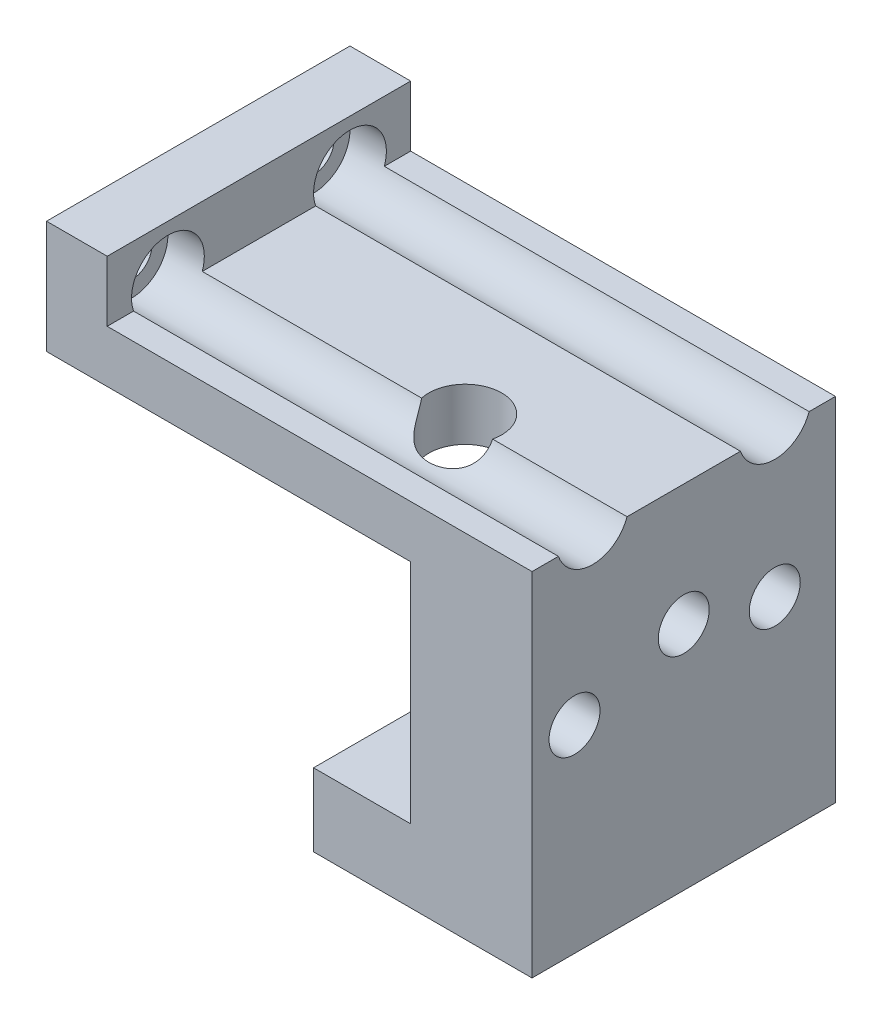
ISO-10303-21;
HEADER;
FILE_DESCRIPTION(('STEP AP214'),'2;1');
FILE_NAME('part.step','',(''),(''),'','','');
FILE_SCHEMA(('AUTOMOTIVE_DESIGN { 1 0 10303 214 1 1 1 1 }'));
ENDSEC;
DATA;
#1=APPLICATION_CONTEXT('core data for automotive mechanical design processes');
#2=APPLICATION_PROTOCOL_DEFINITION('international standard','automotive_design',2000,#1);
#3=PRODUCT_CONTEXT('',#1,'mechanical');
#4=PRODUCT('Part','Part','',(#3));
#5=PRODUCT_RELATED_PRODUCT_CATEGORY('part','',(#4));
#6=PRODUCT_DEFINITION_FORMATION('','',#4);
#7=PRODUCT_DEFINITION_CONTEXT('part definition',#1,'design');
#8=PRODUCT_DEFINITION('design','',#6,#7);
#9=PRODUCT_DEFINITION_SHAPE('','',#8);
#10=(LENGTH_UNIT() NAMED_UNIT(*) SI_UNIT(.MILLI.,.METRE.));
#11=(NAMED_UNIT(*) PLANE_ANGLE_UNIT() SI_UNIT($,.RADIAN.));
#12=(NAMED_UNIT(*) SI_UNIT($,.STERADIAN.) SOLID_ANGLE_UNIT());
#13=UNCERTAINTY_MEASURE_WITH_UNIT(LENGTH_MEASURE(1.E-05),#10,'distance_accuracy_value','');
#14=(GEOMETRIC_REPRESENTATION_CONTEXT(3) GLOBAL_UNCERTAINTY_ASSIGNED_CONTEXT((#13)) GLOBAL_UNIT_ASSIGNED_CONTEXT((#10,
#11,#12)) REPRESENTATION_CONTEXT('',''));
#15=CARTESIAN_POINT('',(0.,0.,0.));
#16=DIRECTION('',(0.,0.,1.));
#17=DIRECTION('',(1.,0.,0.));
#18=AXIS2_PLACEMENT_3D('',#15,#16,#17);
#19=CARTESIAN_POINT('',(20.,-17.,12.5));
#20=DIRECTION('',(-1.,0.,0.));
#21=DIRECTION('',(0.,0.,1.));
#22=AXIS2_PLACEMENT_3D('',#19,#20,#21);
#23=PLANE('',#22);
#24=CARTESIAN_POINT('',(20.,0.199999999999997,-7.5));
#25=DIRECTION('',(1.,0.,0.));
#26=DIRECTION('',(0.,0.,-1.));
#27=AXIS2_PLACEMENT_3D('',#24,#25,#26);
#28=CIRCLE('',#27,2.10000000000001);
#29=CARTESIAN_POINT('',(20.,0.199999999999997,-9.60000000000002));
#30=VERTEX_POINT('',#29);
#31=EDGE_CURVE('E351',#30,#30,#28,.T.);
#32=ORIENTED_EDGE('',*,*,#31,.F.);
#33=EDGE_LOOP('',(#32));
#34=FACE_BOUND('',#33,.T.);
#35=CARTESIAN_POINT('',(20.,2.,0.));
#36=DIRECTION('',(1.,0.,0.));
#37=DIRECTION('',(0.,0.,-1.));
#38=AXIS2_PLACEMENT_3D('',#35,#36,#37);
#39=CIRCLE('',#38,2.1);
#40=CARTESIAN_POINT('',(20.,2.,-2.1));
#41=VERTEX_POINT('',#40);
#42=EDGE_CURVE('E147',#41,#41,#39,.T.);
#43=ORIENTED_EDGE('',*,*,#42,.F.);
#44=EDGE_LOOP('',(#43));
#45=FACE_BOUND('',#44,.T.);
#46=CARTESIAN_POINT('',(20.,-0.700000000000006,9.));
#47=DIRECTION('',(1.,0.,0.));
#48=DIRECTION('',(0.,0.,-1.));
#49=AXIS2_PLACEMENT_3D('',#46,#47,#48);
#50=CIRCLE('',#49,2.1);
#51=CARTESIAN_POINT('',(20.,-0.700000000000006,6.9));
#52=VERTEX_POINT('',#51);
#53=EDGE_CURVE('E357',#52,#52,#50,.T.);
#54=ORIENTED_EDGE('',*,*,#53,.F.);
#55=EDGE_LOOP('',(#54));
#56=FACE_BOUND('',#55,.T.);
#57=DIRECTION('',(0.,1.,0.));
#58=VECTOR('',#57,1.);
#59=CARTESIAN_POINT('',(20.,-17.,-12.5));
#60=LINE('',#59,#58);
#61=CARTESIAN_POINT('',(20.,-17.,-12.5));
#62=VERTEX_POINT('',#61);
#63=CARTESIAN_POINT('',(20.,12.,-12.5));
#64=VERTEX_POINT('',#63);
#65=EDGE_CURVE('E195',#62,#64,#60,.T.);
#66=ORIENTED_EDGE('',*,*,#65,.T.);
#67=DIRECTION('',(0.,0.,1.));
#68=VECTOR('',#67,1.);
#69=CARTESIAN_POINT('',(20.,12.,-12.5));
#70=LINE('',#69,#68);
#71=CARTESIAN_POINT('',(20.,12.,-10.3284271247462));
#72=VERTEX_POINT('',#71);
#73=EDGE_CURVE('E239',#64,#72,#70,.T.);
#74=ORIENTED_EDGE('',*,*,#73,.T.);
#75=CARTESIAN_POINT('',(20.,13.,-7.5));
#76=DIRECTION('',(1.,0.,0.));
#77=DIRECTION('',(0.,0.,-1.));
#78=AXIS2_PLACEMENT_3D('',#75,#76,#77);
#79=CIRCLE('',#78,3.);
#80=CARTESIAN_POINT('',(20.,12.,-4.67157287525381));
#81=VERTEX_POINT('',#80);
#82=EDGE_CURVE('E183',#81,#72,#79,.T.);
#83=ORIENTED_EDGE('',*,*,#82,.F.);
#84=CARTESIAN_POINT('',(20.,12.,4.67157287525382));
#85=VERTEX_POINT('',#84);
#86=EDGE_CURVE('E249',#81,#85,#70,.T.);
#87=ORIENTED_EDGE('',*,*,#86,.T.);
#88=CARTESIAN_POINT('',(20.,13.,7.5));
#89=DIRECTION('',(1.,0.,0.));
#90=DIRECTION('',(0.,0.,-1.));
#91=AXIS2_PLACEMENT_3D('',#88,#89,#90);
#92=CIRCLE('',#91,3.);
#93=CARTESIAN_POINT('',(20.,12.,10.3284271247462));
#94=VERTEX_POINT('',#93);
#95=EDGE_CURVE('E161',#94,#85,#92,.T.);
#96=ORIENTED_EDGE('',*,*,#95,.F.);
#97=CARTESIAN_POINT('',(20.,12.,12.5));
#98=VERTEX_POINT('',#97);
#99=EDGE_CURVE('E235',#94,#98,#70,.T.);
#100=ORIENTED_EDGE('',*,*,#99,.T.);
#101=DIRECTION('',(0.,1.,0.));
#102=VECTOR('',#101,1.);
#103=CARTESIAN_POINT('',(20.,-17.,12.5));
#104=LINE('',#103,#102);
#105=CARTESIAN_POINT('',(20.,-17.,12.5));
#106=VERTEX_POINT('',#105);
#107=EDGE_CURVE('E196',#106,#98,#104,.T.);
#108=ORIENTED_EDGE('',*,*,#107,.F.);
#109=DIRECTION('',(0.,0.,-1.));
#110=VECTOR('',#109,1.);
#111=CARTESIAN_POINT('',(20.,-17.,12.5));
#112=LINE('',#111,#110);
#113=EDGE_CURVE('E207',#106,#62,#112,.T.);
#114=ORIENTED_EDGE('',*,*,#113,.T.);
#115=EDGE_LOOP('',(#66,#74,#83,#87,#96,#100,#108,#114));
#116=FACE_BOUND('',#115,.T.);
#117=ADVANCED_FACE('F39',(#34,#45,#56,#116),#23,.F.);
#118=CARTESIAN_POINT('',(-20.,17.,12.5));
#119=DIRECTION('',(0.,-1.,0.));
#120=DIRECTION('',(0.,0.,-1.));
#121=AXIS2_PLACEMENT_3D('',#118,#119,#120);
#122=PLANE('',#121);
#123=DIRECTION('',(-1.,0.,0.));
#124=VECTOR('',#123,1.);
#125=CARTESIAN_POINT('',(-20.,17.,12.5));
#126=LINE('',#125,#124);
#127=CARTESIAN_POINT('',(-15.,17.,12.5));
#128=VERTEX_POINT('',#127);
#129=CARTESIAN_POINT('',(-20.,17.,12.5));
#130=VERTEX_POINT('',#129);
#131=EDGE_CURVE('E199',#128,#130,#126,.T.);
#132=ORIENTED_EDGE('',*,*,#131,.F.);
#133=DIRECTION('',(0.,0.,1.));
#134=VECTOR('',#133,1.);
#135=CARTESIAN_POINT('',(-15.,17.,-12.5));
#136=LINE('',#135,#134);
#137=CARTESIAN_POINT('',(-15.,17.,-12.5));
#138=VERTEX_POINT('',#137);
#139=EDGE_CURVE('E236',#138,#128,#136,.T.);
#140=ORIENTED_EDGE('',*,*,#139,.F.);
#141=DIRECTION('',(-1.,0.,0.));
#142=VECTOR('',#141,1.);
#143=CARTESIAN_POINT('',(-20.,17.,-12.5));
#144=LINE('',#143,#142);
#145=CARTESIAN_POINT('',(-20.,17.,-12.5));
#146=VERTEX_POINT('',#145);
#147=EDGE_CURVE('E210',#138,#146,#144,.T.);
#148=ORIENTED_EDGE('',*,*,#147,.T.);
#149=DIRECTION('',(0.,0.,-1.));
#150=VECTOR('',#149,1.);
#151=CARTESIAN_POINT('',(-20.,17.,12.5));
#152=LINE('',#151,#150);
#153=EDGE_CURVE('E218',#130,#146,#152,.T.);
#154=ORIENTED_EDGE('',*,*,#153,.F.);
#155=EDGE_LOOP('',(#132,#140,#148,#154));
#156=FACE_BOUND('',#155,.T.);
#157=ADVANCED_FACE('F289',(#156),#122,.F.);
#158=CARTESIAN_POINT('',(-20.,-17.,12.5));
#159=DIRECTION('',(1.,0.,0.));
#160=DIRECTION('',(0.,0.,-1.));
#161=AXIS2_PLACEMENT_3D('',#158,#159,#160);
#162=PLANE('',#161);
#163=CARTESIAN_POINT('',(-20.,13.,7.5));
#164=DIRECTION('',(1.,0.,0.));
#165=DIRECTION('',(0.,0.,-1.));
#166=AXIS2_PLACEMENT_3D('',#163,#164,#165);
#167=CIRCLE('',#166,1.69999999999999);
#168=CARTESIAN_POINT('',(-20.,13.,5.80000000000001));
#169=VERTEX_POINT('',#168);
#170=EDGE_CURVE('E180',#169,#169,#167,.T.);
#171=ORIENTED_EDGE('',*,*,#170,.T.);
#172=EDGE_LOOP('',(#171));
#173=FACE_BOUND('',#172,.T.);
#174=CARTESIAN_POINT('',(-20.,13.,-7.5));
#175=DIRECTION('',(1.,0.,0.));
#176=DIRECTION('',(0.,0.,-1.));
#177=AXIS2_PLACEMENT_3D('',#174,#175,#176);
#178=CIRCLE('',#177,1.69999999999999);
#179=CARTESIAN_POINT('',(-20.,13.,-9.19999999999999));
#180=VERTEX_POINT('',#179);
#181=EDGE_CURVE('E192',#180,#180,#178,.T.);
#182=ORIENTED_EDGE('',*,*,#181,.T.);
#183=EDGE_LOOP('',(#182));
#184=FACE_BOUND('',#183,.T.);
#185=DIRECTION('',(0.,-1.,0.));
#186=VECTOR('',#185,1.);
#187=CARTESIAN_POINT('',(-20.,-17.,-12.5));
#188=LINE('',#187,#186);
#189=CARTESIAN_POINT('',(-20.,7.7,-12.5));
#190=VERTEX_POINT('',#189);
#191=EDGE_CURVE('E212',#146,#190,#188,.T.);
#192=ORIENTED_EDGE('',*,*,#191,.T.);
#193=DIRECTION('',(0.,0.,1.));
#194=VECTOR('',#193,1.);
#195=CARTESIAN_POINT('',(-20.,7.7,-12.5));
#196=LINE('',#195,#194);
#197=CARTESIAN_POINT('',(-20.,7.7,12.5));
#198=VERTEX_POINT('',#197);
#199=EDGE_CURVE('E283',#190,#198,#196,.T.);
#200=ORIENTED_EDGE('',*,*,#199,.T.);
#201=DIRECTION('',(0.,-1.,0.));
#202=VECTOR('',#201,1.);
#203=CARTESIAN_POINT('',(-20.,-17.,12.5));
#204=LINE('',#203,#202);
#205=EDGE_CURVE('E202',#130,#198,#204,.T.);
#206=ORIENTED_EDGE('',*,*,#205,.F.);
#207=ORIENTED_EDGE('',*,*,#153,.T.);
#208=EDGE_LOOP('',(#192,#200,#206,#207));
#209=FACE_BOUND('',#208,.T.);
#210=ADVANCED_FACE('F294',(#173,#184,#209),#162,.F.);
#211=CARTESIAN_POINT('',(-20.,-17.,12.5));
#212=DIRECTION('',(0.,1.,0.));
#213=DIRECTION('',(0.,0.,1.));
#214=AXIS2_PLACEMENT_3D('',#211,#212,#213);
#215=PLANE('',#214);
#216=CARTESIAN_POINT('',(5.99999999999999,-17.,4.));
#217=DIRECTION('',(0.,1.,0.));
#218=DIRECTION('',(0.,0.,1.));
#219=AXIS2_PLACEMENT_3D('',#216,#217,#218);
#220=CIRCLE('',#219,1.025);
#221=CARTESIAN_POINT('',(5.99999999999999,-17.,5.025));
#222=VERTEX_POINT('',#221);
#223=EDGE_CURVE('E324',#222,#222,#220,.T.);
#224=ORIENTED_EDGE('',*,*,#223,.T.);
#225=EDGE_LOOP('',(#224));
#226=FACE_BOUND('',#225,.T.);
#227=DIRECTION('',(1.,0.,0.));
#228=VECTOR('',#227,1.);
#229=CARTESIAN_POINT('',(-20.,-17.,12.5));
#230=LINE('',#229,#228);
#231=CARTESIAN_POINT('',(2.,-17.,12.5));
#232=VERTEX_POINT('',#231);
#233=EDGE_CURVE('E205',#232,#106,#230,.T.);
#234=ORIENTED_EDGE('',*,*,#233,.F.);
#235=DIRECTION('',(0.,0.,1.));
#236=VECTOR('',#235,1.);
#237=CARTESIAN_POINT('',(2.,-17.,-12.5));
#238=LINE('',#237,#236);
#239=CARTESIAN_POINT('',(2.,-17.,-12.5));
#240=VERTEX_POINT('',#239);
#241=EDGE_CURVE('E314',#240,#232,#238,.T.);
#242=ORIENTED_EDGE('',*,*,#241,.F.);
#243=DIRECTION('',(1.,0.,0.));
#244=VECTOR('',#243,1.);
#245=CARTESIAN_POINT('',(-20.,-17.,-12.5));
#246=LINE('',#245,#244);
#247=EDGE_CURVE('E200',#240,#62,#246,.T.);
#248=ORIENTED_EDGE('',*,*,#247,.T.);
#249=ORIENTED_EDGE('',*,*,#113,.F.);
#250=EDGE_LOOP('',(#234,#242,#248,#249));
#251=FACE_BOUND('',#250,.T.);
#252=ADVANCED_FACE('F269',(#226,#251),#215,.F.);
#253=CARTESIAN_POINT('',(0.,0.,12.5));
#254=DIRECTION('',(0.,0.,-1.));
#255=DIRECTION('',(-1.,0.,0.));
#256=AXIS2_PLACEMENT_3D('',#253,#254,#255);
#257=PLANE('',#256);
#258=ORIENTED_EDGE('',*,*,#205,.T.);
#259=DIRECTION('',(-1.,0.,0.));
#260=VECTOR('',#259,1.);
#261=CARTESIAN_POINT('',(-20.,7.7,12.5));
#262=LINE('',#261,#260);
#263=CARTESIAN_POINT('',(10.,7.69999999999999,12.5));
#264=VERTEX_POINT('',#263);
#265=EDGE_CURVE('E297',#264,#198,#262,.T.);
#266=ORIENTED_EDGE('',*,*,#265,.F.);
#267=DIRECTION('',(0.,1.,0.));
#268=VECTOR('',#267,1.);
#269=CARTESIAN_POINT('',(10.,-11.,12.5));
#270=LINE('',#269,#268);
#271=CARTESIAN_POINT('',(10.,-11.,12.5));
#272=VERTEX_POINT('',#271);
#273=EDGE_CURVE('E299',#272,#264,#270,.T.);
#274=ORIENTED_EDGE('',*,*,#273,.F.);
#275=DIRECTION('',(1.,0.,0.));
#276=VECTOR('',#275,1.);
#277=CARTESIAN_POINT('',(10.,-11.,12.5));
#278=LINE('',#277,#276);
#279=CARTESIAN_POINT('',(2.,-11.,12.5));
#280=VERTEX_POINT('',#279);
#281=EDGE_CURVE('E304',#280,#272,#278,.T.);
#282=ORIENTED_EDGE('',*,*,#281,.F.);
#283=DIRECTION('',(0.,1.,0.));
#284=VECTOR('',#283,1.);
#285=CARTESIAN_POINT('',(2.,-11.,12.5));
#286=LINE('',#285,#284);
#287=EDGE_CURVE('E266',#232,#280,#286,.T.);
#288=ORIENTED_EDGE('',*,*,#287,.F.);
#289=ORIENTED_EDGE('',*,*,#233,.T.);
#290=ORIENTED_EDGE('',*,*,#107,.T.);
#291=DIRECTION('',(1.,0.,0.));
#292=VECTOR('',#291,1.);
#293=CARTESIAN_POINT('',(20.,12.,12.5));
#294=LINE('',#293,#292);
#295=CARTESIAN_POINT('',(-15.,12.,12.5));
#296=VERTEX_POINT('',#295);
#297=EDGE_CURVE('E260',#296,#98,#294,.T.);
#298=ORIENTED_EDGE('',*,*,#297,.F.);
#299=DIRECTION('',(0.,-1.,0.));
#300=VECTOR('',#299,1.);
#301=CARTESIAN_POINT('',(-15.,17.,12.5));
#302=LINE('',#301,#300);
#303=EDGE_CURVE('E282',#128,#296,#302,.T.);
#304=ORIENTED_EDGE('',*,*,#303,.F.);
#305=ORIENTED_EDGE('',*,*,#131,.T.);
#306=EDGE_LOOP('',(#258,#266,#274,#282,#288,#289,#290,#298,#304,#305));
#307=FACE_BOUND('',#306,.T.);
#308=ADVANCED_FACE('F258',(#307),#257,.F.);
#309=CARTESIAN_POINT('',(0.,0.,-12.5));
#310=DIRECTION('',(0.,0.,-1.));
#311=DIRECTION('',(-1.,0.,0.));
#312=AXIS2_PLACEMENT_3D('',#309,#310,#311);
#313=PLANE('',#312);
#314=DIRECTION('',(-1.,0.,0.));
#315=VECTOR('',#314,1.);
#316=CARTESIAN_POINT('',(-20.,7.7,-12.5));
#317=LINE('',#316,#315);
#318=CARTESIAN_POINT('',(10.,7.69999999999999,-12.5));
#319=VERTEX_POINT('',#318);
#320=EDGE_CURVE('E315',#319,#190,#317,.T.);
#321=ORIENTED_EDGE('',*,*,#320,.T.);
#322=ORIENTED_EDGE('',*,*,#191,.F.);
#323=ORIENTED_EDGE('',*,*,#147,.F.);
#324=DIRECTION('',(0.,-1.,0.));
#325=VECTOR('',#324,1.);
#326=CARTESIAN_POINT('',(-15.,17.,-12.5));
#327=LINE('',#326,#325);
#328=CARTESIAN_POINT('',(-15.,12.,-12.5));
#329=VERTEX_POINT('',#328);
#330=EDGE_CURVE('E277',#138,#329,#327,.T.);
#331=ORIENTED_EDGE('',*,*,#330,.T.);
#332=DIRECTION('',(1.,0.,0.));
#333=VECTOR('',#332,1.);
#334=CARTESIAN_POINT('',(20.,12.,-12.5));
#335=LINE('',#334,#333);
#336=EDGE_CURVE('E242',#329,#64,#335,.T.);
#337=ORIENTED_EDGE('',*,*,#336,.T.);
#338=ORIENTED_EDGE('',*,*,#65,.F.);
#339=ORIENTED_EDGE('',*,*,#247,.F.);
#340=DIRECTION('',(0.,1.,0.));
#341=VECTOR('',#340,1.);
#342=CARTESIAN_POINT('',(2.,-11.,-12.5));
#343=LINE('',#342,#341);
#344=CARTESIAN_POINT('',(2.,-11.,-12.5));
#345=VERTEX_POINT('',#344);
#346=EDGE_CURVE('E301',#240,#345,#343,.T.);
#347=ORIENTED_EDGE('',*,*,#346,.T.);
#348=DIRECTION('',(1.,0.,0.));
#349=VECTOR('',#348,1.);
#350=CARTESIAN_POINT('',(10.,-11.,-12.5));
#351=LINE('',#350,#349);
#352=CARTESIAN_POINT('',(10.,-11.,-12.5));
#353=VERTEX_POINT('',#352);
#354=EDGE_CURVE('E61',#345,#353,#351,.T.);
#355=ORIENTED_EDGE('',*,*,#354,.T.);
#356=DIRECTION('',(0.,1.,0.));
#357=VECTOR('',#356,1.);
#358=CARTESIAN_POINT('',(10.,-11.,-12.5));
#359=LINE('',#358,#357);
#360=EDGE_CURVE('E317',#353,#319,#359,.T.);
#361=ORIENTED_EDGE('',*,*,#360,.T.);
#362=EDGE_LOOP('',(#321,#322,#323,#331,#337,#338,#339,#347,#355,#361));
#363=FACE_BOUND('',#362,.T.);
#364=ADVANCED_FACE('F273',(#363),#313,.T.);
#365=CARTESIAN_POINT('',(20.,13.,-7.5));
#366=DIRECTION('',(1.,0.,0.));
#367=DIRECTION('',(0.,0.,-1.));
#368=AXIS2_PLACEMENT_3D('',#365,#366,#367);
#369=CYLINDRICAL_SURFACE('',#368,1.69999999999999);
#370=ORIENTED_EDGE('',*,*,#181,.F.);
#371=EDGE_LOOP('',(#370));
#372=FACE_BOUND('',#371,.T.);
#373=CARTESIAN_POINT('',(-18.,13.,-7.5));
#374=DIRECTION('',(1.,0.,0.));
#375=DIRECTION('',(0.,0.,-1.));
#376=AXIS2_PLACEMENT_3D('',#373,#374,#375);
#377=CIRCLE('',#376,1.69999999999999);
#378=CARTESIAN_POINT('',(-18.,13.,-9.19999999999999));
#379=VERTEX_POINT('',#378);
#380=EDGE_CURVE('E189',#379,#379,#377,.T.);
#381=ORIENTED_EDGE('',*,*,#380,.T.);
#382=EDGE_LOOP('',(#381));
#383=FACE_BOUND('',#382,.T.);
#384=ADVANCED_FACE('F417',(#372,#383),#369,.F.);
#385=CARTESIAN_POINT('',(-18.,14.7,-7.5));
#386=DIRECTION('',(-1.,0.,0.));
#387=DIRECTION('',(0.,0.,1.));
#388=AXIS2_PLACEMENT_3D('',#385,#386,#387);
#389=PLANE('',#388);
#390=ORIENTED_EDGE('',*,*,#380,.F.);
#391=EDGE_LOOP('',(#390));
#392=FACE_BOUND('',#391,.T.);
#393=CARTESIAN_POINT('',(-18.,13.,-7.5));
#394=DIRECTION('',(1.,0.,0.));
#395=DIRECTION('',(0.,0.,-1.));
#396=AXIS2_PLACEMENT_3D('',#393,#394,#395);
#397=CIRCLE('',#396,2.99999999999999);
#398=CARTESIAN_POINT('',(-18.,13.,-10.5));
#399=VERTEX_POINT('',#398);
#400=EDGE_CURVE('E186',#399,#399,#397,.T.);
#401=ORIENTED_EDGE('',*,*,#400,.T.);
#402=EDGE_LOOP('',(#401));
#403=FACE_BOUND('',#402,.T.);
#404=ADVANCED_FACE('F414',(#392,#403),#389,.F.);
#405=CARTESIAN_POINT('',(20.,13.,-7.5));
#406=DIRECTION('',(1.,0.,0.));
#407=DIRECTION('',(0.,0.,-1.));
#408=AXIS2_PLACEMENT_3D('',#405,#406,#407);
#409=CYLINDRICAL_SURFACE('',#408,2.99999999999999);
#410=ORIENTED_EDGE('',*,*,#82,.T.);
#411=DIRECTION('',(1.,0.,0.));
#412=VECTOR('',#411,1.);
#413=CARTESIAN_POINT('',(20.,12.,-10.3284271247462));
#414=LINE('',#413,#412);
#415=CARTESIAN_POINT('',(-15.,12.,-10.3284271247462));
#416=VERTEX_POINT('',#415);
#417=EDGE_CURVE('E168',#72,#416,#414,.F.);
#418=ORIENTED_EDGE('',*,*,#417,.T.);
#419=CARTESIAN_POINT('',(-15.,13.,-7.5));
#420=DIRECTION('',(-1.,0.,0.));
#421=DIRECTION('',(0.,0.,1.));
#422=AXIS2_PLACEMENT_3D('',#419,#420,#421);
#423=CIRCLE('',#422,2.99999999999999);
#424=CARTESIAN_POINT('',(-15.,12.,-4.67157287525382));
#425=VERTEX_POINT('',#424);
#426=EDGE_CURVE('E243',#416,#425,#423,.F.);
#427=ORIENTED_EDGE('',*,*,#426,.T.);
#428=DIRECTION('',(1.,0.,0.));
#429=VECTOR('',#428,1.);
#430=CARTESIAN_POINT('',(20.,12.,-4.67157287525381));
#431=LINE('',#430,#429);
#432=EDGE_CURVE('E174',#425,#81,#431,.T.);
#433=ORIENTED_EDGE('',*,*,#432,.T.);
#434=EDGE_LOOP('',(#410,#418,#427,#433));
#435=FACE_BOUND('',#434,.T.);
#436=ORIENTED_EDGE('',*,*,#400,.F.);
#437=EDGE_LOOP('',(#436));
#438=FACE_BOUND('',#437,.T.);
#439=ADVANCED_FACE('F246',(#435,#438),#409,.F.);
#440=CARTESIAN_POINT('',(20.,13.,7.5));
#441=DIRECTION('',(1.,0.,0.));
#442=DIRECTION('',(0.,0.,-1.));
#443=AXIS2_PLACEMENT_3D('',#440,#441,#442);
#444=CYLINDRICAL_SURFACE('',#443,1.69999999999999);
#445=ORIENTED_EDGE('',*,*,#170,.F.);
#446=EDGE_LOOP('',(#445));
#447=FACE_BOUND('',#446,.T.);
#448=CARTESIAN_POINT('',(-18.,13.,7.5));
#449=DIRECTION('',(1.,0.,0.));
#450=DIRECTION('',(0.,0.,-1.));
#451=AXIS2_PLACEMENT_3D('',#448,#449,#450);
#452=CIRCLE('',#451,1.69999999999999);
#453=CARTESIAN_POINT('',(-18.,13.,5.80000000000001));
#454=VERTEX_POINT('',#453);
#455=EDGE_CURVE('E171',#454,#454,#452,.T.);
#456=ORIENTED_EDGE('',*,*,#455,.T.);
#457=EDGE_LOOP('',(#456));
#458=FACE_BOUND('',#457,.T.);
#459=ADVANCED_FACE('F407',(#447,#458),#444,.F.);
#460=CARTESIAN_POINT('',(-18.,14.7,7.5));
#461=DIRECTION('',(-1.,0.,0.));
#462=DIRECTION('',(0.,0.,1.));
#463=AXIS2_PLACEMENT_3D('',#460,#461,#462);
#464=PLANE('',#463);
#465=ORIENTED_EDGE('',*,*,#455,.F.);
#466=EDGE_LOOP('',(#465));
#467=FACE_BOUND('',#466,.T.);
#468=CARTESIAN_POINT('',(-18.,13.,7.5));
#469=DIRECTION('',(1.,0.,0.));
#470=DIRECTION('',(0.,0.,-1.));
#471=AXIS2_PLACEMENT_3D('',#468,#469,#470);
#472=CIRCLE('',#471,2.99999999999999);
#473=CARTESIAN_POINT('',(-18.,13.,4.50000000000001));
#474=VERTEX_POINT('',#473);
#475=EDGE_CURVE('E167',#474,#474,#472,.T.);
#476=ORIENTED_EDGE('',*,*,#475,.T.);
#477=EDGE_LOOP('',(#476));
#478=FACE_BOUND('',#477,.T.);
#479=ADVANCED_FACE('F404',(#467,#478),#464,.F.);
#480=CARTESIAN_POINT('',(20.,13.,7.5));
#481=DIRECTION('',(1.,0.,0.));
#482=DIRECTION('',(0.,0.,-1.));
#483=AXIS2_PLACEMENT_3D('',#480,#481,#482);
#484=CYLINDRICAL_SURFACE('',#483,2.99999999999999);
#485=DIRECTION('',(1.,0.,0.));
#486=VECTOR('',#485,1.);
#487=CARTESIAN_POINT('',(20.,12.,4.67157287525382));
#488=LINE('',#487,#486);
#489=CARTESIAN_POINT('',(8.92386557030643,12.,4.67157287525382));
#490=VERTEX_POINT('',#489);
#491=EDGE_CURVE('E11',#85,#490,#488,.F.);
#492=ORIENTED_EDGE('',*,*,#491,.T.);
#493=CARTESIAN_POINT('',(8.92386557030643,12.,4.67157287525382));
#494=CARTESIAN_POINT('',(8.91824452741485,11.9308975569617,4.69599230759184));
#495=CARTESIAN_POINT('',(8.91174341772976,11.8627517208346,4.72294567593767));
#496=CARTESIAN_POINT('',(8.89653902882799,11.7287835058749,4.78166558257303));
#497=CARTESIAN_POINT('',(8.88783471665539,11.6629622334384,4.81343437573002));
#498=CARTESIAN_POINT('',(8.86774818336343,11.5338739009091,4.88163655331347));
#499=CARTESIAN_POINT('',(8.85635589428415,11.4706175178647,4.91808723424469));
#500=CARTESIAN_POINT('',(8.83042185354018,11.3473920771007,4.99517146478185));
#501=CARTESIAN_POINT('',(8.81588060169429,11.2874224995741,5.03580435003138));
#502=CARTESIAN_POINT('',(8.78307860815653,11.1709506234487,5.12096540943517));
#503=CARTESIAN_POINT('',(8.7648015152428,11.1144650392885,5.16551019904775));
#504=CARTESIAN_POINT('',(8.72409272362707,11.0056935234804,5.25771905923518));
#505=CARTESIAN_POINT('',(8.70166142009029,10.9534071930602,5.30538283284109));
#506=CARTESIAN_POINT('',(8.65230012812847,10.8535463040653,5.40295536059));
#507=CARTESIAN_POINT('',(8.62538267336257,10.8059591905795,5.45285758457198));
#508=CARTESIAN_POINT('',(8.5667047296256,10.7156271141493,5.5541722459374));
#509=CARTESIAN_POINT('',(8.53494473858147,10.6728816541555,5.60558452761298));
#510=CARTESIAN_POINT('',(8.4691048750605,10.595551154962,5.7049306981108));
#511=CARTESIAN_POINT('',(8.43540178446494,10.560589138612,5.75282147977846));
#512=CARTESIAN_POINT('',(8.36371748512978,10.4949208089221,5.84835252842612));
#513=CARTESIAN_POINT('',(8.32573477520591,10.4642159973812,5.89599270132698));
#514=CARTESIAN_POINT('',(8.24557713456977,10.4069736307523,5.99027895947606));
#515=CARTESIAN_POINT('',(8.20340056799383,10.3804377122853,6.03692464813026));
#516=CARTESIAN_POINT('',(8.11506107281136,10.331342482632,6.12851519250596));
#517=CARTESIAN_POINT('',(8.06889659464461,10.308784727667,6.17345937723917));
#518=CARTESIAN_POINT('',(7.92800870999933,10.2480590865373,6.30184605333609));
#519=CARTESIAN_POINT('',(7.82812935364252,10.2149377509753,6.38212768110092));
#520=CARTESIAN_POINT('',(7.61688546297365,10.1599390587359,6.53029259156109));
#521=CARTESIAN_POINT('',(7.50551859094541,10.138063996123,6.59817334285172));
#522=CARTESIAN_POINT('',(7.26236187393854,10.1009304773419,6.72526579160222));
#523=CARTESIAN_POINT('',(7.12964191937855,10.0865431803359,6.78295048410694));
#524=CARTESIAN_POINT('',(6.8567004591901,10.0646229274672,6.87871393219909));
#525=CARTESIAN_POINT('',(6.71647530950371,10.0570933338388,6.91678306658999));
#526=CARTESIAN_POINT('',(6.49556904454643,10.0489859634162,6.9598747071307));
#527=CARTESIAN_POINT('',(6.41626891663197,10.0468052764562,6.9720628128547));
#528=CARTESIAN_POINT('',(6.25692958761732,10.04364374884,6.99005122315103));
#529=CARTESIAN_POINT('',(6.17689059480768,10.0426625798486,6.99585327568724));
#530=CARTESIAN_POINT('',(6.01655372529879,10.0417857238508,7.00102752191662));
#531=CARTESIAN_POINT('',(5.93625571865872,10.0418907115814,7.00039571880522));
#532=CARTESIAN_POINT('',(5.77600553368512,10.0432005428122,6.99270084427451));
#533=CARTESIAN_POINT('',(5.69605324204759,10.0444049933563,6.98564007061933));
#534=CARTESIAN_POINT('',(5.53418324771834,10.0481101444693,6.96477774269075));
#535=CARTESIAN_POINT('',(5.45229602123091,10.0506551765872,6.95074665184287));
#536=CARTESIAN_POINT('',(5.29005820938686,10.0573450205428,6.9159668335648));
#537=CARTESIAN_POINT('',(5.20970705995528,10.0614892328108,6.89522062425664));
#538=CARTESIAN_POINT('',(5.05106096451403,10.0717890683581,6.84717192059029));
#539=CARTESIAN_POINT('',(4.97276739030095,10.0779459985254,6.81986516943528));
#540=CARTESIAN_POINT('',(4.81894547947703,10.0927909806214,6.75897592464351));
#541=CARTESIAN_POINT('',(4.74341584799476,10.1014778297752,6.72539641591737));
#542=CARTESIAN_POINT('',(4.59713683106317,10.1218050214183,6.65301807838389));
#543=CARTESIAN_POINT('',(4.5263235006506,10.1333854414294,6.61433186518435));
#544=CARTESIAN_POINT('',(4.38857405894002,10.1602162265662,6.53174848158256));
#545=CARTESIAN_POINT('',(4.32163600514695,10.1754647329411,6.48785395610932));
#546=CARTESIAN_POINT('',(4.19225870832974,10.2102876220304,6.39549222620786));
#547=CARTESIAN_POINT('',(4.12981596705914,10.2298585916854,6.34702864675811));
#548=CARTESIAN_POINT('',(4.00995539194658,10.2739685947144,6.24629638421692));
#549=CARTESIAN_POINT('',(3.952536808166,10.2985068848155,6.19402827115599));
#550=CARTESIAN_POINT('',(3.84880629882156,10.3503044445839,6.09215194624518));
#551=CARTESIAN_POINT('',(3.80195893572855,10.3770301373718,6.04281698921418));
#552=CARTESIAN_POINT('',(3.71299119508576,10.4352074772596,5.94269774189676));
#553=CARTESIAN_POINT('',(3.67087025289372,10.4666585587883,5.89191362564542));
#554=CARTESIAN_POINT('',(3.59154409708237,10.5344199392311,5.78983625902482));
#555=CARTESIAN_POINT('',(3.55433457110813,10.5707259182564,5.73854349838679));
#556=CARTESIAN_POINT('',(3.48480925868882,10.6482069644566,5.63634999013399));
#557=CARTESIAN_POINT('',(3.45249319992472,10.6893817604569,5.58544922085483));
#558=CARTESIAN_POINT('',(3.36866640780576,10.8113934549075,5.44469535654493));
#559=CARTESIAN_POINT('',(3.32247457751061,10.8976143219688,5.35624691564982));
#560=CARTESIAN_POINT('',(3.24374086031474,11.083971370307,5.18815586829407));
#561=CARTESIAN_POINT('',(3.21122202200089,11.18413067245,5.10852829624522));
#562=CARTESIAN_POINT('',(3.17041117029639,11.3441188752902,4.99751299427534));
#563=CARTESIAN_POINT('',(3.15803442680848,11.3998242195082,4.96152266442593));
#564=CARTESIAN_POINT('',(3.13579805910473,11.5138888223751,4.89310729928651));
#565=CARTESIAN_POINT('',(3.12593876183944,11.5722484245844,4.8606827274064));
#566=CARTESIAN_POINT('',(3.10839855975023,11.6910869327427,4.79977921511665));
#567=CARTESIAN_POINT('',(3.10071160190757,11.7515594115831,4.7712894265175));
#568=CARTESIAN_POINT('',(3.08714911052319,11.8744211800291,4.7183537936076));
#569=CARTESIAN_POINT('',(3.08127291991839,11.9368097652896,4.69390648392069));
#570=CARTESIAN_POINT('',(3.07613442969355,12.,4.67157287525382));
#571=B_SPLINE_CURVE_WITH_KNOTS('',3,(#493,#494,#495,#496,#497,#498,#499,#500,#501,#502,#503,
#504,#505,#506,#507,#508,#509,#510,#511,#512,#513,#514,#515,#516,#517,#518,#519,#520,#521,#522,
#523,#524,#525,#526,#527,#528,#529,#530,#531,#532,#533,#534,#535,#536,#537,#538,#539,#540,#541,
#542,#543,#544,#545,#546,#547,#548,#549,#550,#551,#552,#553,#554,#555,#556,#557,#558,#559,#560,
#561,#562,#563,#564,#565,#566,#567,#568,#569,#570),.UNSPECIFIED.,.F.,.F.,(4,2,2,2,2,2,2,2,2,2,2,
2,2,2,2,2,2,2,2,2,2,2,2,2,2,2,2,2,2,2,2,2,2,2,2,2,2,2,4),(0.,0.220476954874274,
0.441057470901933,0.662477679041187,0.883862768004752,1.10623841353223,1.32859291664871,
1.55033629900328,1.77205689626496,1.97640406215945,2.18082313244515,2.38532225395957,
2.58990119706948,2.98515534116243,3.38049007898793,3.81502496136887,4.24977277550758,
4.49032762806134,4.73081662055582,4.97145501741438,5.21200744198198,5.46106621907584,
5.71003170887752,5.95915917788531,6.20816839943219,6.4523956526129,6.69649940683418,
6.94041109908685,7.18428632115478,7.40326290285822,7.62221329659222,7.84097014873665,
8.05971482269347,8.45340385389428,8.8477538922655,9.04998808256549,9.25224852446395,
9.45393970122815,9.65555760501712),.UNSPECIFIED.);
#572=CARTESIAN_POINT('',(3.07613442969355,12.,4.67157287525382));
#573=VERTEX_POINT('',#572);
#574=EDGE_CURVE('E143',#490,#573,#571,.T.);
#575=ORIENTED_EDGE('',*,*,#574,.T.);
#576=CARTESIAN_POINT('',(-15.,12.,4.67157287525382));
#577=VERTEX_POINT('',#576);
#578=EDGE_CURVE('E47',#573,#577,#488,.F.);
#579=ORIENTED_EDGE('',*,*,#578,.T.);
#580=CARTESIAN_POINT('',(-15.,13.,7.5));
#581=DIRECTION('',(-1.,0.,0.));
#582=DIRECTION('',(0.,0.,1.));
#583=AXIS2_PLACEMENT_3D('',#580,#581,#582);
#584=CIRCLE('',#583,2.99999999999999);
#585=CARTESIAN_POINT('',(-15.,12.,10.3284271247462));
#586=VERTEX_POINT('',#585);
#587=EDGE_CURVE('E221',#577,#586,#584,.F.);
#588=ORIENTED_EDGE('',*,*,#587,.T.);
#589=DIRECTION('',(1.,0.,0.));
#590=VECTOR('',#589,1.);
#591=CARTESIAN_POINT('',(20.,12.,10.3284271247462));
#592=LINE('',#591,#590);
#593=EDGE_CURVE('E164',#586,#94,#592,.T.);
#594=ORIENTED_EDGE('',*,*,#593,.T.);
#595=ORIENTED_EDGE('',*,*,#95,.T.);
#596=EDGE_LOOP('',(#492,#575,#579,#588,#594,#595));
#597=FACE_BOUND('',#596,.T.);
#598=ORIENTED_EDGE('',*,*,#475,.F.);
#599=EDGE_LOOP('',(#598));
#600=FACE_BOUND('',#599,.T.);
#601=ADVANCED_FACE('F157',(#597,#600),#484,.F.);
#602=CARTESIAN_POINT('',(20.,12.,-12.5));
#603=DIRECTION('',(0.,-1.,0.));
#604=DIRECTION('',(1.,0.,0.));
#605=AXIS2_PLACEMENT_3D('',#602,#603,#604);
#606=PLANE('',#605);
#607=ORIENTED_EDGE('',*,*,#73,.F.);
#608=ORIENTED_EDGE('',*,*,#336,.F.);
#609=DIRECTION('',(0.,0.,1.));
#610=VECTOR('',#609,1.);
#611=CARTESIAN_POINT('',(-15.,12.,-12.5));
#612=LINE('',#611,#610);
#613=EDGE_CURVE('E232',#329,#416,#612,.T.);
#614=ORIENTED_EDGE('',*,*,#613,.T.);
#615=ORIENTED_EDGE('',*,*,#417,.F.);
#616=EDGE_LOOP('',(#607,#608,#614,#615));
#617=FACE_BOUND('',#616,.T.);
#618=ADVANCED_FACE('F403',(#617),#606,.F.);
#619=ORIENTED_EDGE('',*,*,#578,.F.);
#620=CARTESIAN_POINT('',(5.99999999999999,12.,4.));
#621=DIRECTION('',(0.,1.,0.));
#622=DIRECTION('',(0.,0.,1.));
#623=AXIS2_PLACEMENT_3D('',#620,#621,#622);
#624=CIRCLE('',#623,3.00000000000001);
#625=EDGE_CURVE('E53',#490,#573,#624,.T.);
#626=ORIENTED_EDGE('',*,*,#625,.F.);
#627=ORIENTED_EDGE('',*,*,#491,.F.);
#628=ORIENTED_EDGE('',*,*,#86,.F.);
#629=ORIENTED_EDGE('',*,*,#432,.F.);
#630=EDGE_CURVE('E227',#425,#577,#612,.T.);
#631=ORIENTED_EDGE('',*,*,#630,.T.);
#632=EDGE_LOOP('',(#619,#626,#627,#628,#629,#631));
#633=FACE_BOUND('',#632,.T.);
#634=ADVANCED_FACE('F151',(#633),#606,.F.);
#635=EDGE_CURVE('E230',#586,#296,#612,.T.);
#636=ORIENTED_EDGE('',*,*,#635,.T.);
#637=ORIENTED_EDGE('',*,*,#297,.T.);
#638=ORIENTED_EDGE('',*,*,#99,.F.);
#639=ORIENTED_EDGE('',*,*,#593,.F.);
#640=EDGE_LOOP('',(#636,#637,#638,#639));
#641=FACE_BOUND('',#640,.T.);
#642=ADVANCED_FACE('F284',(#641),#606,.F.);
#643=CARTESIAN_POINT('',(-15.,17.,-12.5));
#644=DIRECTION('',(-1.,0.,0.));
#645=DIRECTION('',(0.,0.,1.));
#646=AXIS2_PLACEMENT_3D('',#643,#644,#645);
#647=PLANE('',#646);
#648=ORIENTED_EDGE('',*,*,#613,.F.);
#649=ORIENTED_EDGE('',*,*,#330,.F.);
#650=ORIENTED_EDGE('',*,*,#139,.T.);
#651=ORIENTED_EDGE('',*,*,#303,.T.);
#652=ORIENTED_EDGE('',*,*,#635,.F.);
#653=ORIENTED_EDGE('',*,*,#587,.F.);
#654=ORIENTED_EDGE('',*,*,#630,.F.);
#655=ORIENTED_EDGE('',*,*,#426,.F.);
#656=EDGE_LOOP('',(#648,#649,#650,#651,#652,#653,#654,#655));
#657=FACE_BOUND('',#656,.T.);
#658=ADVANCED_FACE('F226',(#657),#647,.F.);
#659=CARTESIAN_POINT('',(-20.,7.7,-12.5));
#660=DIRECTION('',(0.,1.,0.));
#661=DIRECTION('',(-1.,0.,0.));
#662=AXIS2_PLACEMENT_3D('',#659,#660,#661);
#663=PLANE('',#662);
#664=CARTESIAN_POINT('',(5.99999999999999,7.7,4.));
#665=DIRECTION('',(0.,1.,0.));
#666=DIRECTION('',(0.,0.,1.));
#667=AXIS2_PLACEMENT_3D('',#664,#665,#666);
#668=CIRCLE('',#667,3.00000000000001);
#669=CARTESIAN_POINT('',(5.99999999999999,7.7,7.00000000000001));
#670=VERTEX_POINT('',#669);
#671=EDGE_CURVE('E148',#670,#670,#668,.T.);
#672=ORIENTED_EDGE('',*,*,#671,.T.);
#673=EDGE_LOOP('',(#672));
#674=FACE_BOUND('',#673,.T.);
#675=ORIENTED_EDGE('',*,*,#265,.T.);
#676=ORIENTED_EDGE('',*,*,#199,.F.);
#677=ORIENTED_EDGE('',*,*,#320,.F.);
#678=DIRECTION('',(0.,0.,1.));
#679=VECTOR('',#678,1.);
#680=CARTESIAN_POINT('',(10.,7.69999999999999,-12.5));
#681=LINE('',#680,#679);
#682=EDGE_CURVE('E309',#319,#264,#681,.T.);
#683=ORIENTED_EDGE('',*,*,#682,.T.);
#684=EDGE_LOOP('',(#675,#676,#677,#683));
#685=FACE_BOUND('',#684,.T.);
#686=ADVANCED_FACE('F371',(#674,#685),#663,.F.);
#687=CARTESIAN_POINT('',(10.,-11.,-12.5));
#688=DIRECTION('',(1.,0.,0.));
#689=DIRECTION('',(0.,1.,0.));
#690=AXIS2_PLACEMENT_3D('',#687,#688,#689);
#691=PLANE('',#690);
#692=CARTESIAN_POINT('',(10.,0.199999999999997,-7.5));
#693=DIRECTION('',(1.,0.,0.));
#694=DIRECTION('',(0.,0.,-1.));
#695=AXIS2_PLACEMENT_3D('',#692,#693,#694);
#696=CIRCLE('',#695,2.10000000000001);
#697=CARTESIAN_POINT('',(10.,0.199999999999997,-9.60000000000001));
#698=VERTEX_POINT('',#697);
#699=EDGE_CURVE('E154',#698,#698,#696,.T.);
#700=ORIENTED_EDGE('',*,*,#699,.T.);
#701=EDGE_LOOP('',(#700));
#702=FACE_BOUND('',#701,.T.);
#703=CARTESIAN_POINT('',(10.,2.,0.));
#704=DIRECTION('',(1.,0.,0.));
#705=DIRECTION('',(0.,1.,0.));
#706=AXIS2_PLACEMENT_3D('',#703,#704,#705);
#707=CIRCLE('',#706,2.1);
#708=CARTESIAN_POINT('',(10.,4.09999999999999,0.));
#709=VERTEX_POINT('',#708);
#710=EDGE_CURVE('E359',#709,#709,#707,.T.);
#711=ORIENTED_EDGE('',*,*,#710,.T.);
#712=EDGE_LOOP('',(#711));
#713=FACE_BOUND('',#712,.T.);
#714=CARTESIAN_POINT('',(10.,-0.700000000000006,9.));
#715=DIRECTION('',(1.,0.,0.));
#716=DIRECTION('',(0.,1.,0.));
#717=AXIS2_PLACEMENT_3D('',#714,#715,#716);
#718=CIRCLE('',#717,2.1);
#719=CARTESIAN_POINT('',(10.,1.39999999999999,9.));
#720=VERTEX_POINT('',#719);
#721=EDGE_CURVE('E42',#720,#720,#718,.T.);
#722=ORIENTED_EDGE('',*,*,#721,.T.);
#723=EDGE_LOOP('',(#722));
#724=FACE_BOUND('',#723,.T.);
#725=ORIENTED_EDGE('',*,*,#273,.T.);
#726=ORIENTED_EDGE('',*,*,#682,.F.);
#727=ORIENTED_EDGE('',*,*,#360,.F.);
#728=DIRECTION('',(0.,0.,1.));
#729=VECTOR('',#728,1.);
#730=CARTESIAN_POINT('',(10.,-11.,-12.5));
#731=LINE('',#730,#729);
#732=EDGE_CURVE('E311',#353,#272,#731,.T.);
#733=ORIENTED_EDGE('',*,*,#732,.T.);
#734=EDGE_LOOP('',(#725,#726,#727,#733));
#735=FACE_BOUND('',#734,.T.);
#736=ADVANCED_FACE('F339',(#702,#713,#724,#735),#691,.F.);
#737=CARTESIAN_POINT('',(10.,-11.,-12.5));
#738=DIRECTION('',(0.,-1.,0.));
#739=DIRECTION('',(0.,0.,-1.));
#740=AXIS2_PLACEMENT_3D('',#737,#738,#739);
#741=PLANE('',#740);
#742=CARTESIAN_POINT('',(5.99999999999999,-11.,4.));
#743=DIRECTION('',(0.,1.,0.));
#744=DIRECTION('',(0.,0.,1.));
#745=AXIS2_PLACEMENT_3D('',#742,#743,#744);
#746=CIRCLE('',#745,1.02499999999999);
#747=CARTESIAN_POINT('',(5.99999999999999,-11.,5.02499999999999));
#748=VERTEX_POINT('',#747);
#749=EDGE_CURVE('E362',#748,#748,#746,.T.);
#750=ORIENTED_EDGE('',*,*,#749,.F.);
#751=EDGE_LOOP('',(#750));
#752=FACE_BOUND('',#751,.T.);
#753=ORIENTED_EDGE('',*,*,#281,.T.);
#754=ORIENTED_EDGE('',*,*,#732,.F.);
#755=ORIENTED_EDGE('',*,*,#354,.F.);
#756=DIRECTION('',(0.,0.,1.));
#757=VECTOR('',#756,1.);
#758=CARTESIAN_POINT('',(2.,-11.,-12.5));
#759=LINE('',#758,#757);
#760=EDGE_CURVE('E313',#345,#280,#759,.T.);
#761=ORIENTED_EDGE('',*,*,#760,.T.);
#762=EDGE_LOOP('',(#753,#754,#755,#761));
#763=FACE_BOUND('',#762,.T.);
#764=ADVANCED_FACE('F326',(#752,#763),#741,.F.);
#765=CARTESIAN_POINT('',(2.,-11.,-12.5));
#766=DIRECTION('',(1.,0.,0.));
#767=DIRECTION('',(0.,0.,-1.));
#768=AXIS2_PLACEMENT_3D('',#765,#766,#767);
#769=PLANE('',#768);
#770=ORIENTED_EDGE('',*,*,#287,.T.);
#771=ORIENTED_EDGE('',*,*,#760,.F.);
#772=ORIENTED_EDGE('',*,*,#346,.F.);
#773=ORIENTED_EDGE('',*,*,#241,.T.);
#774=EDGE_LOOP('',(#770,#771,#772,#773));
#775=FACE_BOUND('',#774,.T.);
#776=ADVANCED_FACE('F328',(#775),#769,.F.);
#777=CARTESIAN_POINT('',(5.99999999999999,-11.,4.));
#778=DIRECTION('',(0.,1.,0.));
#779=DIRECTION('',(0.,0.,1.));
#780=AXIS2_PLACEMENT_3D('',#777,#778,#779);
#781=CYLINDRICAL_SURFACE('',#780,1.02499999999999);
#782=ORIENTED_EDGE('',*,*,#223,.F.);
#783=EDGE_LOOP('',(#782));
#784=FACE_BOUND('',#783,.T.);
#785=ORIENTED_EDGE('',*,*,#749,.T.);
#786=EDGE_LOOP('',(#785));
#787=FACE_BOUND('',#786,.T.);
#788=ADVANCED_FACE('F330',(#784,#787),#781,.F.);
#789=CARTESIAN_POINT('',(20.,-0.700000000000006,9.));
#790=DIRECTION('',(1.,0.,0.));
#791=DIRECTION('',(0.,0.,-1.));
#792=AXIS2_PLACEMENT_3D('',#789,#790,#791);
#793=CYLINDRICAL_SURFACE('',#792,2.1);
#794=ORIENTED_EDGE('',*,*,#53,.T.);
#795=EDGE_LOOP('',(#794));
#796=FACE_BOUND('',#795,.T.);
#797=ORIENTED_EDGE('',*,*,#721,.F.);
#798=EDGE_LOOP('',(#797));
#799=FACE_BOUND('',#798,.T.);
#800=ADVANCED_FACE('F336',(#796,#799),#793,.F.);
#801=CARTESIAN_POINT('',(20.,2.,0.));
#802=DIRECTION('',(1.,0.,0.));
#803=DIRECTION('',(0.,0.,-1.));
#804=AXIS2_PLACEMENT_3D('',#801,#802,#803);
#805=CYLINDRICAL_SURFACE('',#804,2.1);
#806=ORIENTED_EDGE('',*,*,#42,.T.);
#807=EDGE_LOOP('',(#806));
#808=FACE_BOUND('',#807,.T.);
#809=ORIENTED_EDGE('',*,*,#710,.F.);
#810=EDGE_LOOP('',(#809));
#811=FACE_BOUND('',#810,.T.);
#812=ADVANCED_FACE('F386',(#808,#811),#805,.F.);
#813=CARTESIAN_POINT('',(5.99999999999999,12.,4.));
#814=DIRECTION('',(0.,1.,0.));
#815=DIRECTION('',(0.,0.,1.));
#816=AXIS2_PLACEMENT_3D('',#813,#814,#815);
#817=CYLINDRICAL_SURFACE('',#816,3.00000000000001);
#818=ORIENTED_EDGE('',*,*,#671,.F.);
#819=EDGE_LOOP('',(#818));
#820=FACE_BOUND('',#819,.T.);
#821=ORIENTED_EDGE('',*,*,#625,.T.);
#822=ORIENTED_EDGE('',*,*,#574,.F.);
#823=EDGE_LOOP('',(#821,#822));
#824=FACE_BOUND('',#823,.T.);
#825=ADVANCED_FACE('F144',(#820,#824),#817,.F.);
#826=CARTESIAN_POINT('',(20.,0.199999999999997,-7.5));
#827=DIRECTION('',(1.,0.,0.));
#828=DIRECTION('',(0.,0.,-1.));
#829=AXIS2_PLACEMENT_3D('',#826,#827,#828);
#830=CYLINDRICAL_SURFACE('',#829,2.10000000000001);
#831=ORIENTED_EDGE('',*,*,#699,.F.);
#832=EDGE_LOOP('',(#831));
#833=FACE_BOUND('',#832,.T.);
#834=ORIENTED_EDGE('',*,*,#31,.T.);
#835=EDGE_LOOP('',(#834));
#836=FACE_BOUND('',#835,.T.);
#837=ADVANCED_FACE('F393',(#833,#836),#830,.F.);
#838=CLOSED_SHELL('',(#117,#157,#210,#252,#308,#364,#384,#404,#439,#459,#479,#601,#618,#634,
#642,#658,#686,#736,#764,#776,#788,#800,#812,#825,#837));
#839=MANIFOLD_SOLID_BREP('B2',#838);
#840=ADVANCED_BREP_SHAPE_REPRESENTATION('',(#18,#839),#14);
#841=SHAPE_DEFINITION_REPRESENTATION(#9,#840);
ENDSEC;
END-ISO-10303-21;
